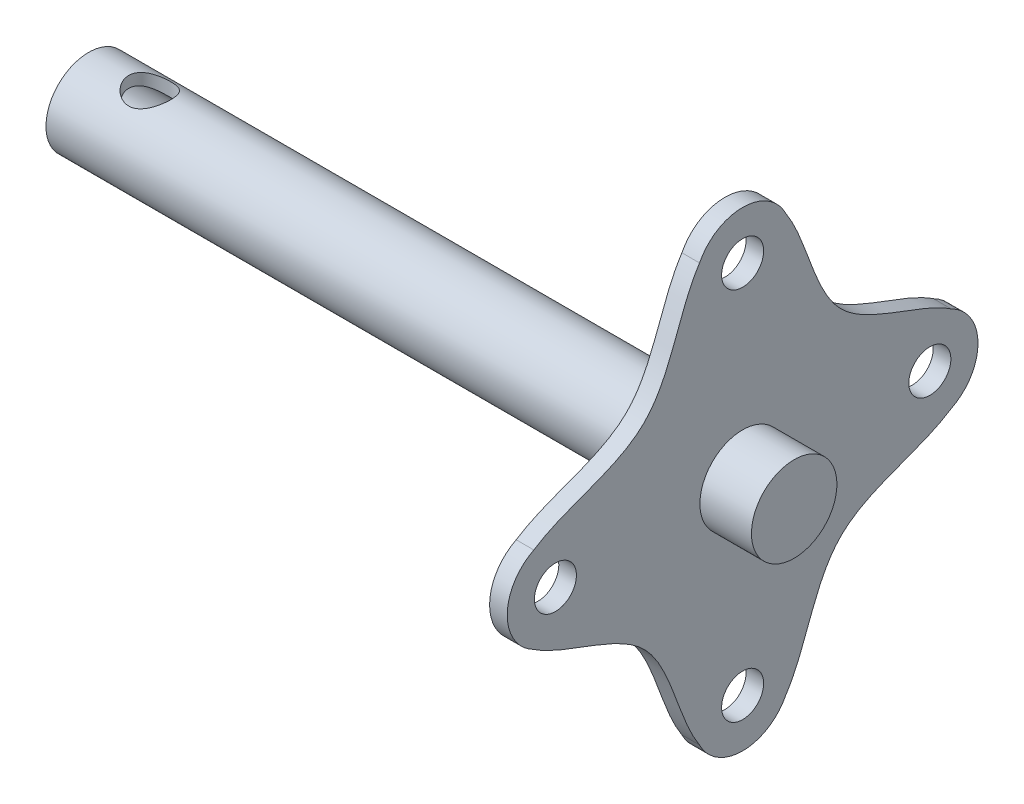
ISO-10303-21;
HEADER;
FILE_DESCRIPTION(('STEP AP214'),'2;1');
FILE_NAME('part.step','',(''),(''),'','','');
FILE_SCHEMA(('AUTOMOTIVE_DESIGN { 1 0 10303 214 1 1 1 1 }'));
ENDSEC;
DATA;
#1=APPLICATION_CONTEXT('core data for automotive mechanical design processes');
#2=APPLICATION_PROTOCOL_DEFINITION('international standard','automotive_design',2000,#1);
#3=PRODUCT_CONTEXT('',#1,'mechanical');
#4=PRODUCT('Part','Part','',(#3));
#5=PRODUCT_RELATED_PRODUCT_CATEGORY('part','',(#4));
#6=PRODUCT_DEFINITION_FORMATION('','',#4);
#7=PRODUCT_DEFINITION_CONTEXT('part definition',#1,'design');
#8=PRODUCT_DEFINITION('design','',#6,#7);
#9=PRODUCT_DEFINITION_SHAPE('','',#8);
#10=(LENGTH_UNIT() NAMED_UNIT(*) SI_UNIT(.MILLI.,.METRE.));
#11=(NAMED_UNIT(*) PLANE_ANGLE_UNIT() SI_UNIT($,.RADIAN.));
#12=(NAMED_UNIT(*) SI_UNIT($,.STERADIAN.) SOLID_ANGLE_UNIT());
#13=UNCERTAINTY_MEASURE_WITH_UNIT(LENGTH_MEASURE(1.E-05),#10,'distance_accuracy_value','');
#14=(GEOMETRIC_REPRESENTATION_CONTEXT(3) GLOBAL_UNCERTAINTY_ASSIGNED_CONTEXT((#13)) GLOBAL_UNIT_ASSIGNED_CONTEXT((#10,
#11,#12)) REPRESENTATION_CONTEXT('',''));
#15=CARTESIAN_POINT('',(0.,0.,0.));
#16=DIRECTION('',(0.,0.,1.));
#17=DIRECTION('',(1.,0.,0.));
#18=AXIS2_PLACEMENT_3D('',#15,#16,#17);
#19=CARTESIAN_POINT('',(43.688,44.069,0.));
#20=DIRECTION('',(-1.,0.,0.));
#21=DIRECTION('',(0.,-1.,0.));
#22=AXIS2_PLACEMENT_3D('',#19,#20,#21);
#23=PLANE('',#22);
#24=CARTESIAN_POINT('',(43.688,0.,0.));
#25=DIRECTION('',(-1.,0.,0.));
#26=DIRECTION('',(0.,-1.,0.));
#27=AXIS2_PLACEMENT_3D('',#24,#25,#26);
#28=CIRCLE('',#27,8.001);
#29=CARTESIAN_POINT('',(43.688,-8.001,0.));
#30=VERTEX_POINT('',#29);
#31=EDGE_CURVE('E576',#30,#30,#28,.T.);
#32=ORIENTED_EDGE('',*,*,#31,.T.);
#33=EDGE_LOOP('',(#32));
#34=FACE_BOUND('',#33,.T.);
#35=CARTESIAN_POINT('',(43.688,35.052,0.));
#36=DIRECTION('',(-1.,0.,0.));
#37=DIRECTION('',(0.,-1.,0.));
#38=AXIS2_PLACEMENT_3D('',#35,#36,#37);
#39=CIRCLE('',#38,9.01700000000001);
#40=CARTESIAN_POINT('',(43.688,39.0864264033594,-8.06409899467209));
#41=VERTEX_POINT('',#40);
#42=CARTESIAN_POINT('',(43.688,39.0864264033595,8.06409899467233));
#43=VERTEX_POINT('',#42);
#44=EDGE_CURVE('E350',#41,#43,#39,.F.);
#45=ORIENTED_EDGE('',*,*,#44,.T.);
#46=CARTESIAN_POINT('',(43.688,8.06409899467319,39.0864264033595));
#47=CARTESIAN_POINT('',(43.688,12.1825211951368,32.8636804844215));
#48=CARTESIAN_POINT('',(43.688,14.2958226438149,14.2947688313508));
#49=CARTESIAN_POINT('',(43.688,32.8644268661158,12.1822744919616));
#50=CARTESIAN_POINT('',(43.688,39.0864264033596,8.06409899467229));
#51=B_SPLINE_CURVE_WITH_KNOTS('',3,(#46,#47,#48,#49,#50),.UNSPECIFIED.,.F.,.F.,(4,1,4),(0.,
0.500028123499448,1.),.UNSPECIFIED.);
#52=CARTESIAN_POINT('',(43.688,8.06409899467319,39.0864264033595));
#53=VERTEX_POINT('',#52);
#54=EDGE_CURVE('E343',#43,#53,#51,.F.);
#55=ORIENTED_EDGE('',*,*,#54,.T.);
#56=CARTESIAN_POINT('',(43.688,1.09337573582874E-12,35.052));
#57=DIRECTION('',(-1.,0.,0.));
#58=DIRECTION('',(0.,-1.,0.));
#59=AXIS2_PLACEMENT_3D('',#56,#57,#58);
#60=CIRCLE('',#59,9.017);
#61=CARTESIAN_POINT('',(43.688,-8.06409899467119,39.0864264033596));
#62=VERTEX_POINT('',#61);
#63=EDGE_CURVE('E329',#62,#53,#60,.T.);
#64=ORIENTED_EDGE('',*,*,#63,.F.);
#65=CARTESIAN_POINT('',(43.688,-39.0864264033584,8.06409899467319));
#66=CARTESIAN_POINT('',(43.688,-32.86332328412,12.1824851024218));
#67=CARTESIAN_POINT('',(43.688,-14.2949603748562,14.2968765241275));
#68=CARTESIAN_POINT('',(43.688,-12.1820364728834,32.8646805234943));
#69=CARTESIAN_POINT('',(43.688,-8.0640989946712,39.0864264033596));
#70=B_SPLINE_CURVE_WITH_KNOTS('',3,(#65,#66,#67,#68,#69),.UNSPECIFIED.,.F.,.F.,(4,1,4),(0.,
0.500051140167016,1.),.UNSPECIFIED.);
#71=CARTESIAN_POINT('',(43.688,-39.0864264033584,8.06409899467319));
#72=VERTEX_POINT('',#71);
#73=EDGE_CURVE('E337',#62,#72,#70,.F.);
#74=ORIENTED_EDGE('',*,*,#73,.T.);
#75=CARTESIAN_POINT('',(43.688,-35.0519999999989,8.1581997967245E-13));
#76=DIRECTION('',(-1.,0.,0.));
#77=DIRECTION('',(0.,-1.,0.));
#78=AXIS2_PLACEMENT_3D('',#75,#76,#77);
#79=CIRCLE('',#78,9.017);
#80=CARTESIAN_POINT('',(43.688,-39.0864264033585,-8.06409899467119));
#81=VERTEX_POINT('',#80);
#82=EDGE_CURVE('E440',#72,#81,#79,.F.);
#83=ORIENTED_EDGE('',*,*,#82,.T.);
#84=CARTESIAN_POINT('',(43.688,-8.06409899467209,-39.0864264033583));
#85=CARTESIAN_POINT('',(43.688,-12.1824851024222,-32.8633232841207));
#86=CARTESIAN_POINT('',(43.688,-14.2968765241268,-14.2949603748562));
#87=CARTESIAN_POINT('',(43.688,-32.8646805234939,-12.1820364728841));
#88=CARTESIAN_POINT('',(43.688,-39.0864264033585,-8.06409899467119));
#89=B_SPLINE_CURVE_WITH_KNOTS('',3,(#84,#85,#86,#87,#88),.UNSPECIFIED.,.F.,.F.,(4,1,4),(0.,
0.500051140167029,1.),.UNSPECIFIED.);
#90=CARTESIAN_POINT('',(43.688,-8.06409899467209,-39.0864264033583));
#91=VERTEX_POINT('',#90);
#92=EDGE_CURVE('E410',#81,#91,#89,.F.);
#93=ORIENTED_EDGE('',*,*,#92,.T.);
#94=CARTESIAN_POINT('',(43.688,2.8184838811666E-13,-35.0519999999989));
#95=DIRECTION('',(-1.,0.,0.));
#96=DIRECTION('',(0.,-1.,0.));
#97=AXIS2_PLACEMENT_3D('',#94,#95,#96);
#98=CIRCLE('',#97,9.017);
#99=CARTESIAN_POINT('',(43.688,8.06409899467229,-39.0864264033585));
#100=VERTEX_POINT('',#99);
#101=EDGE_CURVE('E409',#91,#100,#98,.F.);
#102=ORIENTED_EDGE('',*,*,#101,.T.);
#103=CARTESIAN_POINT('',(43.688,39.0864264033594,-8.06409899467209));
#104=CARTESIAN_POINT('',(43.688,32.8633232841211,-12.1824851024215));
#105=CARTESIAN_POINT('',(43.688,14.294960374857,-14.2968765241268));
#106=CARTESIAN_POINT('',(43.688,12.1820364728836,-32.8646805234932));
#107=CARTESIAN_POINT('',(43.688,8.06409899467229,-39.0864264033585));
#108=B_SPLINE_CURVE_WITH_KNOTS('',3,(#103,#104,#105,#106,#107),.UNSPECIFIED.,.F.,.F.,(4,1,4),
(0.,0.500051140167044,1.),.UNSPECIFIED.);
#109=EDGE_CURVE('E399',#100,#41,#108,.F.);
#110=ORIENTED_EDGE('',*,*,#109,.T.);
#111=EDGE_LOOP('',(#45,#55,#64,#74,#83,#93,#102,#110));
#112=FACE_BOUND('',#111,.T.);
#113=CARTESIAN_POINT('',(43.688,-35.0519999999989,8.1581997967245E-13));
#114=DIRECTION('',(-1.,0.,0.));
#115=DIRECTION('',(0.,-1.,0.));
#116=AXIS2_PLACEMENT_3D('',#113,#114,#115);
#117=CIRCLE('',#116,3.9370000000011);
#118=CARTESIAN_POINT('',(43.688,-38.989,8.1581997967245E-13));
#119=VERTEX_POINT('',#118);
#120=EDGE_CURVE('E455',#119,#119,#117,.F.);
#121=ORIENTED_EDGE('',*,*,#120,.F.);
#122=EDGE_LOOP('',(#121));
#123=FACE_BOUND('',#122,.T.);
#124=CARTESIAN_POINT('',(43.688,2.8184838811666E-13,-35.0519999999989));
#125=DIRECTION('',(-1.,0.,0.));
#126=DIRECTION('',(0.,-1.,0.));
#127=AXIS2_PLACEMENT_3D('',#124,#125,#126);
#128=CIRCLE('',#127,3.93700000000018);
#129=CARTESIAN_POINT('',(43.688,-3.9369999999999,-35.0519999999989));
#130=VERTEX_POINT('',#129);
#131=EDGE_CURVE('E451',#130,#130,#128,.F.);
#132=ORIENTED_EDGE('',*,*,#131,.F.);
#133=EDGE_LOOP('',(#132));
#134=FACE_BOUND('',#133,.T.);
#135=CARTESIAN_POINT('',(43.688,35.052,0.));
#136=DIRECTION('',(-1.,0.,0.));
#137=DIRECTION('',(0.,-1.,0.));
#138=AXIS2_PLACEMENT_3D('',#135,#136,#137);
#139=CIRCLE('',#138,3.93700000000022);
#140=CARTESIAN_POINT('',(43.688,31.1149999999998,0.));
#141=VERTEX_POINT('',#140);
#142=EDGE_CURVE('E359',#141,#141,#139,.F.);
#143=ORIENTED_EDGE('',*,*,#142,.F.);
#144=EDGE_LOOP('',(#143));
#145=FACE_BOUND('',#144,.T.);
#146=CARTESIAN_POINT('',(43.688,1.09337573582874E-12,35.052));
#147=DIRECTION('',(-1.,0.,0.));
#148=DIRECTION('',(0.,-1.,0.));
#149=AXIS2_PLACEMENT_3D('',#146,#147,#148);
#150=CIRCLE('',#149,3.9369999999993);
#151=CARTESIAN_POINT('',(43.688,-3.93699999999821,35.052));
#152=VERTEX_POINT('',#151);
#153=EDGE_CURVE('E533',#152,#152,#150,.T.);
#154=ORIENTED_EDGE('',*,*,#153,.T.);
#155=EDGE_LOOP('',(#154));
#156=FACE_BOUND('',#155,.T.);
#157=ADVANCED_FACE('F262',(#34,#112,#123,#134,#145,#156),#23,.F.);
#158=CARTESIAN_POINT('',(40.386,8.001,0.));
#159=DIRECTION('',(1.,0.,0.));
#160=DIRECTION('',(0.,1.,0.));
#161=AXIS2_PLACEMENT_3D('',#158,#159,#160);
#162=PLANE('',#161);
#163=CARTESIAN_POINT('',(40.386,8.06409899467319,39.0864264033595));
#164=CARTESIAN_POINT('',(40.386,12.1825211951368,32.8636804844215));
#165=CARTESIAN_POINT('',(40.386,14.2958226438149,14.2947688313508));
#166=CARTESIAN_POINT('',(40.386,32.8644268661158,12.1822744919616));
#167=CARTESIAN_POINT('',(40.386,39.0864264033596,8.06409899467229));
#168=B_SPLINE_CURVE_WITH_KNOTS('',3,(#163,#164,#165,#166,#167),.UNSPECIFIED.,.F.,.F.,(4,1,4),
(0.,0.500028123499448,1.),.UNSPECIFIED.);
#169=CARTESIAN_POINT('',(40.386,39.0864264033595,8.06409899467233));
#170=VERTEX_POINT('',#169);
#171=CARTESIAN_POINT('',(40.386,8.0640989946732,39.0864264033595));
#172=VERTEX_POINT('',#171);
#173=EDGE_CURVE('E12',#170,#172,#168,.F.);
#174=ORIENTED_EDGE('',*,*,#173,.F.);
#175=CARTESIAN_POINT('',(40.386,35.052,0.));
#176=DIRECTION('',(1.,0.,0.));
#177=DIRECTION('',(0.,1.,0.));
#178=AXIS2_PLACEMENT_3D('',#175,#176,#177);
#179=CIRCLE('',#178,9.01700000000001);
#180=CARTESIAN_POINT('',(40.386,39.0864264033596,-8.06409899467228));
#181=VERTEX_POINT('',#180);
#182=EDGE_CURVE('E511',#181,#170,#179,.T.);
#183=ORIENTED_EDGE('',*,*,#182,.F.);
#184=CARTESIAN_POINT('',(40.386,39.0864264033594,-8.06409899467209));
#185=CARTESIAN_POINT('',(40.386,32.8633232841211,-12.1824851024215));
#186=CARTESIAN_POINT('',(40.386,14.294960374857,-14.2968765241268));
#187=CARTESIAN_POINT('',(40.386,12.1820364728836,-32.8646805234932));
#188=CARTESIAN_POINT('',(40.386,8.06409899467229,-39.0864264033585));
#189=B_SPLINE_CURVE_WITH_KNOTS('',3,(#184,#185,#186,#187,#188),.UNSPECIFIED.,.F.,.F.,(4,1,4),
(0.,0.500051140167044,1.),.UNSPECIFIED.);
#190=CARTESIAN_POINT('',(40.386,8.06409899467229,-39.0864264033585));
#191=VERTEX_POINT('',#190);
#192=EDGE_CURVE('E272',#191,#181,#189,.F.);
#193=ORIENTED_EDGE('',*,*,#192,.F.);
#194=CARTESIAN_POINT('',(40.386,2.8184838811666E-13,-35.0519999999989));
#195=DIRECTION('',(1.,0.,0.));
#196=DIRECTION('',(0.,1.,0.));
#197=AXIS2_PLACEMENT_3D('',#194,#195,#196);
#198=CIRCLE('',#197,9.017);
#199=CARTESIAN_POINT('',(40.386,-8.0640989946721,-39.0864264033584));
#200=VERTEX_POINT('',#199);
#201=EDGE_CURVE('E505',#200,#191,#198,.T.);
#202=ORIENTED_EDGE('',*,*,#201,.F.);
#203=CARTESIAN_POINT('',(40.386,-8.06409899467209,-39.0864264033583));
#204=CARTESIAN_POINT('',(40.386,-12.1824851024222,-32.8633232841207));
#205=CARTESIAN_POINT('',(40.386,-14.2968765241268,-14.2949603748562));
#206=CARTESIAN_POINT('',(40.386,-32.8646805234939,-12.1820364728841));
#207=CARTESIAN_POINT('',(40.386,-39.0864264033585,-8.06409899467119));
#208=B_SPLINE_CURVE_WITH_KNOTS('',3,(#203,#204,#205,#206,#207),.UNSPECIFIED.,.F.,.F.,(4,1,4),
(0.,0.500051140167029,1.),.UNSPECIFIED.);
#209=CARTESIAN_POINT('',(40.386,-39.0864264033585,-8.06409899467119));
#210=VERTEX_POINT('',#209);
#211=EDGE_CURVE('E507',#210,#200,#208,.F.);
#212=ORIENTED_EDGE('',*,*,#211,.F.);
#213=CARTESIAN_POINT('',(40.386,-35.0519999999989,8.1581997967245E-13));
#214=DIRECTION('',(1.,0.,0.));
#215=DIRECTION('',(0.,1.,0.));
#216=AXIS2_PLACEMENT_3D('',#213,#214,#215);
#217=CIRCLE('',#216,9.017);
#218=CARTESIAN_POINT('',(40.386,-39.0864264033584,8.06409899467319));
#219=VERTEX_POINT('',#218);
#220=EDGE_CURVE('E489',#219,#210,#217,.T.);
#221=ORIENTED_EDGE('',*,*,#220,.F.);
#222=CARTESIAN_POINT('',(40.386,-39.0864264033584,8.06409899467319));
#223=CARTESIAN_POINT('',(40.386,-32.86332328412,12.1824851024218));
#224=CARTESIAN_POINT('',(40.386,-14.2949603748562,14.2968765241275));
#225=CARTESIAN_POINT('',(40.386,-12.1820364728834,32.8646805234943));
#226=CARTESIAN_POINT('',(40.386,-8.0640989946712,39.0864264033596));
#227=B_SPLINE_CURVE_WITH_KNOTS('',3,(#222,#223,#224,#225,#226),.UNSPECIFIED.,.F.,.F.,(4,1,4),
(0.,0.500051140167016,1.),.UNSPECIFIED.);
#228=CARTESIAN_POINT('',(40.386,-8.06409899467119,39.0864264033596));
#229=VERTEX_POINT('',#228);
#230=EDGE_CURVE('E497',#229,#219,#227,.F.);
#231=ORIENTED_EDGE('',*,*,#230,.F.);
#232=CARTESIAN_POINT('',(40.386,1.09337573582874E-12,35.052));
#233=DIRECTION('',(1.,0.,0.));
#234=DIRECTION('',(0.,1.,0.));
#235=AXIS2_PLACEMENT_3D('',#232,#233,#234);
#236=CIRCLE('',#235,9.017);
#237=EDGE_CURVE('E288',#229,#172,#236,.F.);
#238=ORIENTED_EDGE('',*,*,#237,.T.);
#239=EDGE_LOOP('',(#174,#183,#193,#202,#212,#221,#231,#238));
#240=FACE_BOUND('',#239,.T.);
#241=CARTESIAN_POINT('',(40.386,0.,0.));
#242=DIRECTION('',(-1.,0.,0.));
#243=DIRECTION('',(0.,-1.,0.));
#244=AXIS2_PLACEMENT_3D('',#241,#242,#243);
#245=CIRCLE('',#244,8.001);
#246=CARTESIAN_POINT('',(40.386,-8.001,0.));
#247=VERTEX_POINT('',#246);
#248=EDGE_CURVE('E466',#247,#247,#245,.T.);
#249=ORIENTED_EDGE('',*,*,#248,.F.);
#250=EDGE_LOOP('',(#249));
#251=FACE_BOUND('',#250,.T.);
#252=CARTESIAN_POINT('',(40.386,-35.0519999999989,8.1581997967245E-13));
#253=DIRECTION('',(1.,0.,0.));
#254=DIRECTION('',(0.,1.,0.));
#255=AXIS2_PLACEMENT_3D('',#252,#253,#254);
#256=CIRCLE('',#255,3.9370000000011);
#257=CARTESIAN_POINT('',(40.386,-31.1149999999978,8.1581997967245E-13));
#258=VERTEX_POINT('',#257);
#259=EDGE_CURVE('E458',#258,#258,#256,.T.);
#260=ORIENTED_EDGE('',*,*,#259,.T.);
#261=EDGE_LOOP('',(#260));
#262=FACE_BOUND('',#261,.T.);
#263=CARTESIAN_POINT('',(40.386,2.8184838811666E-13,-35.0519999999989));
#264=DIRECTION('',(1.,0.,0.));
#265=DIRECTION('',(0.,1.,0.));
#266=AXIS2_PLACEMENT_3D('',#263,#264,#265);
#267=CIRCLE('',#266,3.93700000000018);
#268=CARTESIAN_POINT('',(40.386,3.93700000000046,-35.0519999999989));
#269=VERTEX_POINT('',#268);
#270=EDGE_CURVE('E454',#269,#269,#267,.T.);
#271=ORIENTED_EDGE('',*,*,#270,.T.);
#272=EDGE_LOOP('',(#271));
#273=FACE_BOUND('',#272,.T.);
#274=CARTESIAN_POINT('',(40.386,35.052,0.));
#275=DIRECTION('',(1.,0.,0.));
#276=DIRECTION('',(0.,1.,0.));
#277=AXIS2_PLACEMENT_3D('',#274,#275,#276);
#278=CIRCLE('',#277,3.93700000000022);
#279=CARTESIAN_POINT('',(40.386,38.9890000000002,0.));
#280=VERTEX_POINT('',#279);
#281=EDGE_CURVE('E353',#280,#280,#278,.T.);
#282=ORIENTED_EDGE('',*,*,#281,.T.);
#283=EDGE_LOOP('',(#282));
#284=FACE_BOUND('',#283,.T.);
#285=CARTESIAN_POINT('',(40.386,1.09337573582874E-12,35.052));
#286=DIRECTION('',(1.,0.,0.));
#287=DIRECTION('',(0.,1.,0.));
#288=AXIS2_PLACEMENT_3D('',#285,#286,#287);
#289=CIRCLE('',#288,3.9369999999993);
#290=CARTESIAN_POINT('',(40.386,3.9370000000004,35.052));
#291=VERTEX_POINT('',#290);
#292=EDGE_CURVE('E267',#291,#291,#289,.F.);
#293=ORIENTED_EDGE('',*,*,#292,.F.);
#294=EDGE_LOOP('',(#293));
#295=FACE_BOUND('',#294,.T.);
#296=ADVANCED_FACE('F479',(#240,#251,#262,#273,#284,#295),#162,.F.);
#297=CARTESIAN_POINT('',(-53.34,0.,0.));
#298=DIRECTION('',(-1.,0.,0.));
#299=DIRECTION('',(0.,-1.,0.));
#300=AXIS2_PLACEMENT_3D('',#297,#298,#299);
#301=CYLINDRICAL_SURFACE('',#300,8.001);
#302=CARTESIAN_POINT('',(-67.31,6.96534507400746,3.937));
#303=CARTESIAN_POINT('',(-67.4128745950958,6.9653458303171,3.93699939109406));
#304=CARTESIAN_POINT('',(-67.5157613248099,6.96763214874904,3.93296213981109));
#305=CARTESIAN_POINT('',(-67.7207454803312,6.97669317154756,3.91686558861347));
#306=CARTESIAN_POINT('',(-67.8228424986573,6.98347005460043,3.9048023947424));
#307=CARTESIAN_POINT('',(-68.0255890651015,7.00127778350322,3.87278282861104));
#308=CARTESIAN_POINT('',(-68.1262359771466,7.01231555822405,3.85281359854815));
#309=CARTESIAN_POINT('',(-68.3252140016487,7.03824802506605,3.80523230037071));
#310=CARTESIAN_POINT('',(-68.4235440915821,7.05314438662359,3.77761692375639));
#311=CARTESIAN_POINT('',(-68.7129922842562,7.10271329437791,3.6840828441296));
#312=CARTESIAN_POINT('',(-68.8998564748345,7.14238903037297,3.60726809257177));
#313=CARTESIAN_POINT('',(-69.2579013857005,7.23049720279591,3.42722871425422));
#314=CARTESIAN_POINT('',(-69.4290816884626,7.27892987224291,3.32400338468742));
#315=CARTESIAN_POINT('',(-69.7660983283385,7.38382054941182,3.08441718271683));
#316=CARTESIAN_POINT('',(-69.9304200061645,7.4406105408515,2.94607039257622));
#317=CARTESIAN_POINT('',(-70.2347542543281,7.55315768309138,2.64418169360324));
#318=CARTESIAN_POINT('',(-70.3747550200687,7.60891432067127,2.48062762223439));
#319=CARTESIAN_POINT('',(-70.5680056387821,7.68940339963424,2.21326577631231));
#320=CARTESIAN_POINT('',(-70.6312366207172,7.71646474779913,2.11722354303));
#321=CARTESIAN_POINT('',(-70.7493062116086,7.76801352536852,1.9194751855407));
#322=CARTESIAN_POINT('',(-70.8041483719917,7.79250204260421,1.81777148314046));
#323=CARTESIAN_POINT('',(-70.9049156011855,7.83820350831586,1.60933341586212));
#324=CARTESIAN_POINT('',(-70.9508407094417,7.85941647128151,1.50259907324023));
#325=CARTESIAN_POINT('',(-71.033237314902,7.89792382301572,1.28491430981459));
#326=CARTESIAN_POINT('',(-71.0697140675198,7.91522038950599,1.17396627232507));
#327=CARTESIAN_POINT('',(-71.1306035443868,7.94433002365216,0.956462204693508));
#328=CARTESIAN_POINT('',(-71.1556739104861,7.95643861470096,0.850129629410474));
#329=CARTESIAN_POINT('',(-71.1969222980051,7.9764572967297,0.635411309529433));
#330=CARTESIAN_POINT('',(-71.2131046291536,7.98436942247418,0.527026586420898));
#331=CARTESIAN_POINT('',(-71.2363779438817,7.99577217161585,0.30908264143395));
#332=CARTESIAN_POINT('',(-71.2434713869572,7.99926399116558,0.199523745387619));
#333=CARTESIAN_POINT('',(-71.2484783930669,8.00172726997892,-0.0198499832965085));
#334=CARTESIAN_POINT('',(-71.2463924947167,8.00069899446772,-0.129664800539739));
#335=CARTESIAN_POINT('',(-71.2336328937154,7.99442922939904,-0.33933774676054));
#336=CARTESIAN_POINT('',(-71.2237005128483,7.98955147075929,-0.439252380088351));
#337=CARTESIAN_POINT('',(-71.1962883991126,7.97616038408474,-0.637803321326534));
#338=CARTESIAN_POINT('',(-71.1788062289685,7.96764588202091,-0.736439205821742));
#339=CARTESIAN_POINT('',(-71.115292433819,7.93692936274259,-1.02933419863571));
#340=CARTESIAN_POINT('',(-71.0581810696312,7.90954784270354,-1.22077867598568));
#341=CARTESIAN_POINT('',(-70.9156559742738,7.84300900830077,-1.59364257729763));
#342=CARTESIAN_POINT('',(-70.8298529527929,7.80369044710555,-1.77488167242374));
#343=CARTESIAN_POINT('',(-70.6328840124716,7.71685004533034,-2.12086303649826));
#344=CARTESIAN_POINT('',(-70.5217089280418,7.66932524178118,-2.28559931282621));
#345=CARTESIAN_POINT('',(-70.265339034986,7.56538852827251,-2.61008526149251));
#346=CARTESIAN_POINT('',(-70.1179513109203,7.50856121574129,-2.76797116157195));
#347=CARTESIAN_POINT('',(-69.7992828617512,7.39529123490447,-3.05776366226356));
#348=CARTESIAN_POINT('',(-69.6279849097415,7.33884887497983,-3.18965136487112));
#349=CARTESIAN_POINT('',(-69.2535277704718,7.22907929801775,-3.43149188122206));
#350=CARTESIAN_POINT('',(-69.0490731544142,7.1761425560865,-3.53965237764081));
#351=CARTESIAN_POINT('',(-68.7287859073049,7.10760503382628,-3.67430004853825));
#352=CARTESIAN_POINT('',(-68.6197313119881,7.08656714263441,-3.71458938822289));
#353=CARTESIAN_POINT('',(-68.3978089455742,7.04893169026019,-3.78552239403873));
#354=CARTESIAN_POINT('',(-68.2849435359181,7.03233143409486,-3.81617191645264));
#355=CARTESIAN_POINT('',(-68.0652359765834,7.00538819107579,-3.86539282870238));
#356=CARTESIAN_POINT('',(-67.9586095903597,6.99465848047329,-3.88471915024925));
#357=CARTESIAN_POINT('',(-67.743801197628,6.9780198995748,-3.9145284348531));
#358=CARTESIAN_POINT('',(-67.635620016679,6.97210856055717,-3.92501592663131));
#359=CARTESIAN_POINT('',(-67.4186386213625,6.96534847304411,-3.9370000639504));
#360=CARTESIAN_POINT('',(-67.309838625717,6.96449803506002,-3.93849970991936));
#361=CARTESIAN_POINT('',(-67.0925730127219,6.96789130423071,-3.93249332177485));
#362=CARTESIAN_POINT('',(-66.9841073748794,6.97213469270047,-3.92498785104841));
#363=CARTESIAN_POINT('',(-66.7797647818454,6.98483334024104,-3.90233928129893));
#364=CARTESIAN_POINT('',(-66.6837584833042,6.99280126049184,-3.88807782791903));
#365=CARTESIAN_POINT('',(-66.4934091939678,7.01240823818075,-3.85260114081025));
#366=CARTESIAN_POINT('',(-66.3990667658441,7.02404851328491,-3.83138360051585));
#367=CARTESIAN_POINT('',(-66.1194572789069,7.06395869848555,-3.75761422973843));
#368=CARTESIAN_POINT('',(-65.9374701200216,7.09722733962405,-3.69493001189329));
#369=CARTESIAN_POINT('',(-65.5782056908328,7.17515440815313,-3.54130749066464));
#370=CARTESIAN_POINT('',(-65.4015392989423,7.22026989867108,-3.44919260544447));
#371=CARTESIAN_POINT('',(-65.0651317899764,7.31638270866578,-3.24033166478018));
#372=CARTESIAN_POINT('',(-64.9053993841167,7.36738302752662,-3.12357302352505));
#373=CARTESIAN_POINT('',(-64.5871836809485,7.47695033231689,-2.85221554568781));
#374=CARTESIAN_POINT('',(-64.4312021735031,7.53568474968997,-2.69474463913301));
#375=CARTESIAN_POINT('',(-64.1470699077555,7.64873503682045,-2.35475035603612));
#376=CARTESIAN_POINT('',(-64.0189276251088,7.70304955780089,-2.17221937747697));
#377=CARTESIAN_POINT('',(-63.8492674235564,7.77753589690337,-1.8805312127528));
#378=CARTESIAN_POINT('',(-63.7959818721509,7.80144020347088,-1.77900557278855));
#379=CARTESIAN_POINT('',(-63.6982476169883,7.84594722638788,-1.57110944669225));
#380=CARTESIAN_POINT('',(-63.6537949510707,7.86655142225735,-1.4647411592608));
#381=CARTESIAN_POINT('',(-63.5742396609538,7.90384110044954,-1.24795560021831));
#382=CARTESIAN_POINT('',(-63.5391327917765,7.92052836148436,-1.13754019287668));
#383=CARTESIAN_POINT('',(-63.4786895248115,7.94948214672487,-0.913501120983262));
#384=CARTESIAN_POINT('',(-63.4533520132638,7.96174917485081,-0.799877823734502));
#385=CARTESIAN_POINT('',(-63.4146294374267,7.98058179310605,-0.580772056425314));
#386=CARTESIAN_POINT('',(-63.400373210366,7.98756146937857,-0.475478388457008));
#387=CARTESIAN_POINT('',(-63.3804133825924,7.99735000491514,-0.263851821994805));
#388=CARTESIAN_POINT('',(-63.3747126314522,8.00015747453908,-0.157518589116746));
#389=CARTESIAN_POINT('',(-63.3719519036324,8.00151554256684,0.0552216210849142));
#390=CARTESIAN_POINT('',(-63.3748861075012,8.00006900791964,0.161628500446405));
#391=CARTESIAN_POINT('',(-63.3893345772335,7.9929731247465,0.373728730761459));
#392=CARTESIAN_POINT('',(-63.4008519951801,7.98732223222138,0.479421805186398));
#393=CARTESIAN_POINT('',(-63.4461251343012,7.96522635517352,0.780928324095028));
#394=CARTESIAN_POINT('',(-63.490516539815,7.94366509722196,0.974891486795582));
#395=CARTESIAN_POINT('',(-63.6072175941544,7.8882208223521,1.35220805342243));
#396=CARTESIAN_POINT('',(-63.679531369809,7.85433598409456,1.53555988442258));
#397=CARTESIAN_POINT('',(-63.8533407379191,7.77549122096505,1.89555741388328));
#398=CARTESIAN_POINT('',(-63.9559712164415,7.73011282736002,2.07156215621292));
#399=CARTESIAN_POINT('',(-64.1860700149027,7.63309249675511,2.40458867145141));
#400=CARTESIAN_POINT('',(-64.3135497726364,7.58144767955174,2.56160164856341));
#401=CARTESIAN_POINT('',(-64.6040088910133,7.47118684383854,2.86817020511727));
#402=CARTESIAN_POINT('',(-64.7692291435064,7.41237967118773,3.01553599159749));
#403=CARTESIAN_POINT('',(-65.1231672914727,7.29864896859967,3.28126005404308));
#404=CARTESIAN_POINT('',(-65.3119046738135,7.24372871933916,3.39959402925554));
#405=CARTESIAN_POINT('',(-65.6121349596504,7.1686130079402,3.55392577241262));
#406=CARTESIAN_POINT('',(-65.7166016665821,7.14451113442315,3.60199261803217));
#407=CARTESIAN_POINT('',(-65.9299958029729,7.0999702738811,3.68901234780726));
#408=CARTESIAN_POINT('',(-66.0389209050152,7.07952940492087,3.72796991774082));
#409=CARTESIAN_POINT('',(-66.2601759847357,7.04317285684812,3.79621009198302));
#410=CARTESIAN_POINT('',(-66.3724963250727,7.02724549666498,3.82551770308445));
#411=CARTESIAN_POINT('',(-66.5998202716575,7.0005479357119,3.87415861629942));
#412=CARTESIAN_POINT('',(-66.7148219205911,6.98977408938126,3.89349896993508));
#413=CARTESIAN_POINT('',(-66.9100048925491,6.97637032669398,3.91744505995291));
#414=CARTESIAN_POINT('',(-66.9897619849012,6.97224477429953,3.92477190036305));
#415=CARTESIAN_POINT('',(-67.1496769117247,6.96673176540048,3.9345497641192));
#416=CARTESIAN_POINT('',(-67.2298347715884,6.96534448465171,3.93700047449113));
#417=CARTESIAN_POINT('',(-67.31,6.96534507400746,3.937));
#418=B_SPLINE_CURVE_WITH_KNOTS('',3,(#302,#303,#304,#305,#306,#307,#308,#309,#310,#311,#312,
#313,#314,#315,#316,#317,#318,#319,#320,#321,#322,#323,#324,#325,#326,#327,#328,#329,#330,#331,
#332,#333,#334,#335,#336,#337,#338,#339,#340,#341,#342,#343,#344,#345,#346,#347,#348,#349,#350,
#351,#352,#353,#354,#355,#356,#357,#358,#359,#360,#361,#362,#363,#364,#365,#366,#367,#368,#369,
#370,#371,#372,#373,#374,#375,#376,#377,#378,#379,#380,#381,#382,#383,#384,#385,#386,#387,#388,
#389,#390,#391,#392,#393,#394,#395,#396,#397,#398,#399,#400,#401,#402,#403,#404,#405,#406,#407,
#408,#409,#410,#411,#412,#413,#414,#415,#416,#417),.UNSPECIFIED.,.T.,.F.,(4,2,2,2,2,2,2,2,2,2,2,
2,2,2,2,2,2,2,2,2,2,2,2,2,2,2,2,2,2,2,2,2,2,2,2,2,2,2,2,2,2,2,2,2,2,2,2,2,2,2,2,2,2,2,2,2,2,4),
(0.,0.308540624604432,0.617231053509922,0.926425590042646,1.23575412519034,1.85052895001307,
2.46532013619834,3.12913641114158,3.79327398660734,4.1472756089917,4.50112694670598,
4.8549767190829,5.20862924658205,5.53793555647889,5.86708204740004,6.19613945091173,
6.52517754661129,6.8263840086271,7.12768778097921,7.72970721768849,8.34025079713508,
8.95101528390479,9.61815458546957,10.2857770545226,10.9934821201063,11.3474851660256,
11.701272734383,12.0274983592892,12.3535567352874,12.6795062565892,13.0054353865771,
13.2972499892814,13.5891614526829,14.1725720562963,14.7830671850025,15.3938748573379,
16.0787738040954,16.7638809771206,17.1148566950356,17.465674618865,17.8163329238647,
18.1669512400733,18.4859818151574,18.8051186262065,19.1240404070918,19.4430793659589,
20.040550129994,20.6381092319491,21.2617225494083,21.8856235885381,22.569863305748,
23.2546738189415,23.6067438214922,23.9586323201424,24.3096016276194,24.6603222932781,
24.9007377448373,25.1411686269481),.UNSPECIFIED.);
#419=CARTESIAN_POINT('',(-67.31,6.96534507400746,3.937));
#420=VERTEX_POINT('',#419);
#421=EDGE_CURVE('E483',#420,#420,#418,.T.);
#422=ORIENTED_EDGE('',*,*,#421,.T.);
#423=EDGE_LOOP('',(#422));
#424=FACE_BOUND('',#423,.T.);
#425=CARTESIAN_POINT('',(-78.74,0.,0.));
#426=DIRECTION('',(-1.,0.,0.));
#427=DIRECTION('',(0.,-1.,0.));
#428=AXIS2_PLACEMENT_3D('',#425,#426,#427);
#429=CIRCLE('',#428,8.001);
#430=CARTESIAN_POINT('',(-78.74,-8.001,0.));
#431=VERTEX_POINT('',#430);
#432=EDGE_CURVE('E490',#431,#431,#429,.T.);
#433=ORIENTED_EDGE('',*,*,#432,.F.);
#434=EDGE_LOOP('',(#433));
#435=FACE_BOUND('',#434,.T.);
#436=ORIENTED_EDGE('',*,*,#248,.T.);
#437=EDGE_LOOP('',(#436));
#438=FACE_BOUND('',#437,.T.);
#439=ADVANCED_FACE('F264',(#424,#435,#438),#301,.T.);
#440=CARTESIAN_POINT('',(-78.74,8.001,0.));
#441=DIRECTION('',(1.,0.,0.));
#442=DIRECTION('',(0.,1.,0.));
#443=AXIS2_PLACEMENT_3D('',#440,#441,#442);
#444=PLANE('',#443);
#445=CARTESIAN_POINT('',(-78.74,0.,0.));
#446=DIRECTION('',(-1.,0.,0.));
#447=DIRECTION('',(0.,-1.,0.));
#448=AXIS2_PLACEMENT_3D('',#445,#446,#447);
#449=CIRCLE('',#448,5.90182644626);
#450=CARTESIAN_POINT('',(-78.74,-5.90182644626,0.));
#451=VERTEX_POINT('',#450);
#452=EDGE_CURVE('E571',#451,#451,#449,.T.);
#453=ORIENTED_EDGE('',*,*,#452,.F.);
#454=EDGE_LOOP('',(#453));
#455=FACE_BOUND('',#454,.T.);
#456=ORIENTED_EDGE('',*,*,#432,.T.);
#457=EDGE_LOOP('',(#456));
#458=FACE_BOUND('',#457,.T.);
#459=ADVANCED_FACE('F565',(#455,#458),#444,.F.);
#460=CARTESIAN_POINT('',(-53.34,0.,0.));
#461=DIRECTION('',(-1.,0.,0.));
#462=DIRECTION('',(0.,-1.,0.));
#463=AXIS2_PLACEMENT_3D('',#460,#461,#462);
#464=CYLINDRICAL_SURFACE('',#463,5.90182644626);
#465=CARTESIAN_POINT('',(-67.31,4.39676999646035,3.937));
#466=CARTESIAN_POINT('',(-67.2139137309751,4.39677053680936,3.93699973740308));
#467=CARTESIAN_POINT('',(-67.1178196942551,4.39993400179526,3.93347512856792));
#468=CARTESIAN_POINT('',(-66.9265431363658,4.41242684927236,3.9194553977141));
#469=CARTESIAN_POINT('',(-66.8313607607157,4.42175720001385,3.9089591810961));
#470=CARTESIAN_POINT('',(-66.6426156666474,4.44614647667638,3.88119524503223));
#471=CARTESIAN_POINT('',(-66.5490551597204,4.46121266592464,3.86391893905896));
#472=CARTESIAN_POINT('',(-66.3643156936105,4.49640580339735,3.82290699685214));
#473=CARTESIAN_POINT('',(-66.2731379797241,4.51653534166842,3.79916805428369));
#474=CARTESIAN_POINT('',(-66.0058119226379,4.58289653107054,3.71932424720528));
#475=CARTESIAN_POINT('',(-65.8338112085842,4.63539693995278,3.65427728914144));
#476=CARTESIAN_POINT('',(-65.5035510807174,4.75087260116159,3.50282866915616));
#477=CARTESIAN_POINT('',(-65.3452945168938,4.81385001814654,3.41642259242331));
#478=CARTESIAN_POINT('',(-65.0198580722219,4.95495862459523,3.2090530173606));
#479=CARTESIAN_POINT('',(-64.8551328974822,5.03392169340765,3.08480220289227));
#480=CARTESIAN_POINT('',(-64.54667232968,5.19133636248409,2.81183406579918));
#481=CARTESIAN_POINT('',(-64.4029576689456,5.26978738554337,2.66309288062157));
#482=CARTESIAN_POINT('',(-64.1956081862283,5.38768960731021,2.41135752021519));
#483=CARTESIAN_POINT('',(-64.1239797388365,5.42949172800004,2.31594370579057));
#484=CARTESIAN_POINT('',(-63.9891235740664,5.50970614524467,2.11803549037356));
#485=CARTESIAN_POINT('',(-63.9258922746626,5.5481198848397,2.01554413703652));
#486=CARTESIAN_POINT('',(-63.808562590921,5.62045555681158,1.80402968907782));
#487=CARTESIAN_POINT('',(-63.7544590417142,5.65438002704858,1.69501033591756));
#488=CARTESIAN_POINT('',(-63.6561278473509,5.71672295427462,1.47109746389952));
#489=CARTESIAN_POINT('',(-63.6118980833635,5.74514259238058,1.35620521183235));
#490=CARTESIAN_POINT('',(-63.5384564263079,5.79270546636075,1.13467092641465));
#491=CARTESIAN_POINT('',(-63.5081164687468,5.81253166504491,1.02854909970044));
#492=CARTESIAN_POINT('',(-63.4563272477907,5.84653723504457,0.813279880725489));
#493=CARTESIAN_POINT('',(-63.4348762403786,5.86071771403218,0.704133086452873));
#494=CARTESIAN_POINT('',(-63.401267121266,5.88299421181021,0.483912307770776));
#495=CARTESIAN_POINT('',(-63.3890998597843,5.89109622122545,0.372840331498774));
#496=CARTESIAN_POINT('',(-63.374263825896,5.90098077067354,0.149789390133396));
#497=CARTESIAN_POINT('',(-63.3715937105891,5.90276420415547,0.0378105555146677));
#498=CARTESIAN_POINT('',(-63.3754774152244,5.90017414837792,-0.16879248601065));
#499=CARTESIAN_POINT('',(-63.3806856285862,5.89669881690544,-0.263456959909899));
#500=CARTESIAN_POINT('',(-63.3978791291791,5.88525570113221,-0.451923597658334));
#501=CARTESIAN_POINT('',(-63.4098663992494,5.87728660242965,-0.545725501048486));
#502=CARTESIAN_POINT('',(-63.4404514447419,5.8570351254622,-0.731738861742577));
#503=CARTESIAN_POINT('',(-63.4590469716338,5.84475421435476,-0.823950848856122));
#504=CARTESIAN_POINT('',(-63.502604023917,5.81614862737629,-1.0062312559861));
#505=CARTESIAN_POINT('',(-63.5275680180799,5.79982238338017,-1.0962988298712));
#506=CARTESIAN_POINT('',(-63.6113417909691,5.74541821325178,-1.36166613157337));
#507=CARTESIAN_POINT('',(-63.6791936272502,5.7018061560594,-1.53308206330461));
#508=CARTESIAN_POINT('',(-63.8363455022906,5.60304722082572,-1.86198962581635));
#509=CARTESIAN_POINT('',(-63.9256494481549,5.54789824178398,-2.01947871292266));
#510=CARTESIAN_POINT('',(-64.1362162904327,5.42184909242131,-2.33842281533523));
#511=CARTESIAN_POINT('',(-64.2601372471768,5.34983133097698,-2.49767722693878));
#512=CARTESIAN_POINT('',(-64.5295824261777,5.20092760838349,-2.79455363753571));
#513=CARTESIAN_POINT('',(-64.6751399795151,5.12403424308446,-2.93214157378444));
#514=CARTESIAN_POINT('',(-64.9201274577013,5.00369879137412,-3.13078448555657));
#515=CARTESIAN_POINT('',(-65.0131171948571,4.95982742197311,-3.19964211738307));
#516=CARTESIAN_POINT('',(-65.2053324392061,4.87378794703499,-3.32923453840348));
#517=CARTESIAN_POINT('',(-65.3045593441447,4.83162022678758,-3.38996749725579));
#518=CARTESIAN_POINT('',(-65.6109850291102,4.70990091561342,-3.55915618834959));
#519=CARTESIAN_POINT('',(-65.827411318145,4.63488251394568,-3.65499558577703));
#520=CARTESIAN_POINT('',(-66.2157480208047,4.52822490755068,-3.78573085113692));
#521=CARTESIAN_POINT('',(-66.3827397992046,4.49031580254909,-3.83021317442204));
#522=CARTESIAN_POINT('',(-66.7240363353331,4.43247476662685,-3.89701336075081));
#523=CARTESIAN_POINT('',(-66.8983278338613,4.41251160457329,-3.91936973621833));
#524=CARTESIAN_POINT('',(-67.2502892838412,4.39365369758006,-3.94050778238821));
#525=CARTESIAN_POINT('',(-67.4279706462643,4.3948511233416,-3.93918631746258));
#526=CARTESIAN_POINT('',(-67.7802076552703,4.41833781095162,-3.91281485126497));
#527=CARTESIAN_POINT('',(-67.9547606546452,4.44064414899732,-3.88774563907559));
#528=CARTESIAN_POINT('',(-68.2873977507078,4.50126213307807,-3.81735302361975));
#529=CARTESIAN_POINT('',(-68.445869560672,4.53873163977482,-3.77308766220271));
#530=CARTESIAN_POINT('',(-68.7532249265291,4.62522350813372,-3.6665459071073));
#531=CARTESIAN_POINT('',(-68.9021052383856,4.67424975266648,-3.60426345838761));
#532=CARTESIAN_POINT('',(-69.217790521904,4.79015130051556,-3.44922026609254));
#533=CARTESIAN_POINT('',(-69.3822287742049,4.85863551618224,-3.35285563819905));
#534=CARTESIAN_POINT('',(-69.694498499602,4.99980064723396,-3.13848152048927));
#535=CARTESIAN_POINT('',(-69.8423093978393,5.07248659720531,-3.02044567946287));
#536=CARTESIAN_POINT('',(-70.1503763879792,5.23243521486989,-2.7359278716607));
#537=CARTESIAN_POINT('',(-70.3062656878357,5.31940305946936,-2.56449751549918));
#538=CARTESIAN_POINT('',(-70.5874324040619,5.48270938550434,-2.19371522618989));
#539=CARTESIAN_POINT('',(-70.7127367453121,5.55905719043046,-1.99438809646623));
#540=CARTESIAN_POINT('',(-70.9069050102133,5.680206752916,-1.61212869767405));
#541=CARTESIAN_POINT('',(-70.9819850374172,5.72825053385696,-1.43338769347835));
#542=CARTESIAN_POINT('',(-71.1056198896087,5.80827706244788,-1.06356100076495));
#543=CARTESIAN_POINT('',(-71.1541971276116,5.84027337934543,-0.872485896440634));
#544=CARTESIAN_POINT('',(-71.2224112112628,5.88539583220113,-0.482100251133956));
#545=CARTESIAN_POINT('',(-71.2419186833896,5.8984376056071,-0.282756929280107));
#546=CARTESIAN_POINT('',(-71.2503337332301,5.90404957800199,0.116871748128456));
#547=CARTESIAN_POINT('',(-71.2392442496684,5.89662174302121,0.317157011368673));
#548=CARTESIAN_POINT('',(-71.1891183261806,5.86334708080821,0.697511841151685));
#549=CARTESIAN_POINT('',(-71.1521826116768,5.83888541358417,0.877989374421584));
#550=CARTESIAN_POINT('',(-71.0545205436191,5.77508937435795,1.22957112076266));
#551=CARTESIAN_POINT('',(-70.9937904972922,5.73575269385382,1.40067387420987));
#552=CARTESIAN_POINT('',(-70.8468669642139,5.64248219634835,1.73972277766718));
#553=CARTESIAN_POINT('',(-70.7594092185822,5.58783861043548,1.90692060215156));
#554=CARTESIAN_POINT('',(-70.563484824827,5.4690657559663,2.22479665564132));
#555=CARTESIAN_POINT('',(-70.4550056676651,5.40493084488188,2.37546496454159));
#556=CARTESIAN_POINT('',(-70.2008913038887,5.26081579988079,2.68108224276699));
#557=CARTESIAN_POINT('',(-70.0520955834391,5.17993011897233,2.83297655166239));
#558=CARTESIAN_POINT('',(-69.7320748569986,5.01786385316055,3.1110304908635));
#559=CARTESIAN_POINT('',(-69.5608330993651,4.9366830924729,3.23717071908086));
#560=CARTESIAN_POINT('',(-69.211346430498,4.78786249508765,3.45308632432625));
#561=CARTESIAN_POINT('',(-69.0345948302052,4.71966353089609,3.54488210413513));
#562=CARTESIAN_POINT('',(-68.6651419734059,4.59758519329432,3.70184803506542));
#563=CARTESIAN_POINT('',(-68.4724723771139,4.5436782520632,3.76706957757532));
#564=CARTESIAN_POINT('',(-68.118229466069,4.46787698779271,3.85646468646732));
#565=CARTESIAN_POINT('',(-67.9591230013556,4.4415516471441,3.88650812167271));
#566=CARTESIAN_POINT('',(-67.7173208609834,4.41486440058853,3.9167185043146));
#567=CARTESIAN_POINT('',(-67.6361905747425,4.40810208707647,3.92431284846054));
#568=CARTESIAN_POINT('',(-67.4733752952299,4.39905524920444,3.93445303834765));
#569=CARTESIAN_POINT('',(-67.3916904548717,4.39676953706739,3.93700022325418));
#570=CARTESIAN_POINT('',(-67.31,4.39676999646035,3.937));
#571=B_SPLINE_CURVE_WITH_KNOTS('',3,(#465,#466,#467,#468,#469,#470,#471,#472,#473,#474,#475,
#476,#477,#478,#479,#480,#481,#482,#483,#484,#485,#486,#487,#488,#489,#490,#491,#492,#493,#494,
#495,#496,#497,#498,#499,#500,#501,#502,#503,#504,#505,#506,#507,#508,#509,#510,#511,#512,#513,
#514,#515,#516,#517,#518,#519,#520,#521,#522,#523,#524,#525,#526,#527,#528,#529,#530,#531,#532,
#533,#534,#535,#536,#537,#538,#539,#540,#541,#542,#543,#544,#545,#546,#547,#548,#549,#550,#551,
#552,#553,#554,#555,#556,#557,#558,#559,#560,#561,#562,#563,#564,#565,#566,#567,#568,#569,#570),
.UNSPECIFIED.,.T.,.F.,(4,2,2,2,2,2,2,2,2,2,2,2,2,2,2,2,2,2,2,2,2,2,2,2,2,2,2,2,2,2,2,2,2,2,2,2,
2,2,2,2,2,2,2,2,2,2,2,2,2,2,2,2,4),(0.,0.288157476416702,0.576360206608274,0.864929110150853,
1.15364592612654,1.72484795978327,2.29616815659917,2.95654947586336,3.61757809710011,
3.99639221343017,4.37504421392452,4.75348123313815,5.13183696473357,5.46775152261143,
5.8036001426137,6.13911733122264,6.47458707567762,6.75885566373003,7.04320744191656,
7.32746255885645,7.61182803676099,8.17767990090332,8.74363490274419,9.38399458885355,
10.0253511704712,10.3961842624578,10.7671007562381,11.5069439454402,12.0356840127198,
12.5635021278938,13.0936198630629,13.6241668074801,14.1285909458385,14.6331848044386,
15.2386542544759,15.8448648633265,16.5838718832995,17.3222259670828,17.9189255869463,
18.5151198015064,19.1139595056238,19.7127416954036,20.2677823719078,20.8229092223645,
21.4099829003349,21.9974070021521,22.6772326243801,23.3575685253254,23.9867785907542,
24.6147659969781,25.1047973542707,25.3498475977841,25.5948328132789),.UNSPECIFIED.);
#572=CARTESIAN_POINT('',(-67.31,4.39676999646035,3.937));
#573=VERTEX_POINT('',#572);
#574=EDGE_CURVE('E459',#573,#573,#571,.T.);
#575=ORIENTED_EDGE('',*,*,#574,.T.);
#576=EDGE_LOOP('',(#575));
#577=FACE_BOUND('',#576,.T.);
#578=CARTESIAN_POINT('',(-53.34,0.,0.));
#579=DIRECTION('',(-1.,0.,0.));
#580=DIRECTION('',(0.,-1.,0.));
#581=AXIS2_PLACEMENT_3D('',#578,#579,#580);
#582=CIRCLE('',#581,5.90182644626);
#583=CARTESIAN_POINT('',(-53.34,-5.90182644626,0.));
#584=VERTEX_POINT('',#583);
#585=EDGE_CURVE('E569',#584,#584,#582,.T.);
#586=ORIENTED_EDGE('',*,*,#585,.F.);
#587=EDGE_LOOP('',(#586));
#588=FACE_BOUND('',#587,.T.);
#589=ORIENTED_EDGE('',*,*,#452,.T.);
#590=EDGE_LOOP('',(#589));
#591=FACE_BOUND('',#590,.T.);
#592=ADVANCED_FACE('F468',(#577,#588,#591),#464,.F.);
#593=CARTESIAN_POINT('',(-53.34,5.90182644626,0.));
#594=DIRECTION('',(1.,0.,0.));
#595=DIRECTION('',(0.,1.,0.));
#596=AXIS2_PLACEMENT_3D('',#593,#594,#595);
#597=PLANE('',#596);
#598=ORIENTED_EDGE('',*,*,#585,.T.);
#599=EDGE_LOOP('',(#598));
#600=FACE_BOUND('',#599,.T.);
#601=ADVANCED_FACE('F558',(#600),#597,.F.);
#602=CARTESIAN_POINT('',(53.34,8.001,0.));
#603=DIRECTION('',(-1.,0.,0.));
#604=DIRECTION('',(0.,-1.,0.));
#605=AXIS2_PLACEMENT_3D('',#602,#603,#604);
#606=PLANE('',#605);
#607=CARTESIAN_POINT('',(53.34,0.,0.));
#608=DIRECTION('',(-1.,0.,0.));
#609=DIRECTION('',(0.,-1.,0.));
#610=AXIS2_PLACEMENT_3D('',#607,#608,#609);
#611=CIRCLE('',#610,8.001);
#612=CARTESIAN_POINT('',(53.34,-8.001,0.));
#613=VERTEX_POINT('',#612);
#614=EDGE_CURVE('E572',#613,#613,#611,.T.);
#615=ORIENTED_EDGE('',*,*,#614,.F.);
#616=EDGE_LOOP('',(#615));
#617=FACE_BOUND('',#616,.T.);
#618=ADVANCED_FACE('F555',(#617),#606,.F.);
#619=CARTESIAN_POINT('',(-53.34,0.,0.));
#620=DIRECTION('',(-1.,0.,0.));
#621=DIRECTION('',(0.,-1.,0.));
#622=AXIS2_PLACEMENT_3D('',#619,#620,#621);
#623=CYLINDRICAL_SURFACE('',#622,8.001);
#624=ORIENTED_EDGE('',*,*,#31,.F.);
#625=EDGE_LOOP('',(#624));
#626=FACE_BOUND('',#625,.T.);
#627=ORIENTED_EDGE('',*,*,#614,.T.);
#628=EDGE_LOOP('',(#627));
#629=FACE_BOUND('',#628,.T.);
#630=ADVANCED_FACE('F477',(#626,#629),#623,.T.);
#631=CARTESIAN_POINT('',(-67.31,8.001,0.));
#632=DIRECTION('',(0.,1.,0.));
#633=DIRECTION('',(0.,0.,1.));
#634=AXIS2_PLACEMENT_3D('',#631,#632,#633);
#635=CYLINDRICAL_SURFACE('',#634,3.937);
#636=ORIENTED_EDGE('',*,*,#421,.F.);
#637=EDGE_LOOP('',(#636));
#638=FACE_BOUND('',#637,.T.);
#639=ORIENTED_EDGE('',*,*,#574,.F.);
#640=EDGE_LOOP('',(#639));
#641=FACE_BOUND('',#640,.T.);
#642=ADVANCED_FACE('F471',(#638,#641),#635,.F.);
#643=CARTESIAN_POINT('',(106.010977480221,-35.0519999999989,8.1581997967245E-13));
#644=DIRECTION('',(-1.,0.,0.));
#645=DIRECTION('',(0.,0.,1.));
#646=AXIS2_PLACEMENT_3D('',#643,#644,#645);
#647=CYLINDRICAL_SURFACE('',#646,3.9370000000011);
#648=ORIENTED_EDGE('',*,*,#120,.T.);
#649=EDGE_LOOP('',(#648));
#650=FACE_BOUND('',#649,.T.);
#651=ORIENTED_EDGE('',*,*,#259,.F.);
#652=EDGE_LOOP('',(#651));
#653=FACE_BOUND('',#652,.T.);
#654=ADVANCED_FACE('F476',(#650,#653),#647,.F.);
#655=CARTESIAN_POINT('',(106.010977480221,2.8184838811666E-13,-35.0519999999989));
#656=DIRECTION('',(-1.,0.,0.));
#657=DIRECTION('',(0.,0.,1.));
#658=AXIS2_PLACEMENT_3D('',#655,#656,#657);
#659=CYLINDRICAL_SURFACE('',#658,3.93700000000018);
#660=ORIENTED_EDGE('',*,*,#131,.T.);
#661=EDGE_LOOP('',(#660));
#662=FACE_BOUND('',#661,.T.);
#663=ORIENTED_EDGE('',*,*,#270,.F.);
#664=EDGE_LOOP('',(#663));
#665=FACE_BOUND('',#664,.T.);
#666=ADVANCED_FACE('F589',(#662,#665),#659,.F.);
#667=CARTESIAN_POINT('',(106.010977480221,1.09337573582874E-12,35.052));
#668=DIRECTION('',(-1.,0.,0.));
#669=DIRECTION('',(0.,0.,1.));
#670=AXIS2_PLACEMENT_3D('',#667,#668,#669);
#671=CYLINDRICAL_SURFACE('',#670,9.017);
#672=DIRECTION('',(-1.,0.,0.));
#673=VECTOR('',#672,1.);
#674=CARTESIAN_POINT('',(106.010977480221,-8.06409899467119,39.0864264033596));
#675=LINE('',#674,#673);
#676=EDGE_CURVE('E333',#62,#229,#675,.T.);
#677=ORIENTED_EDGE('',*,*,#676,.F.);
#678=ORIENTED_EDGE('',*,*,#63,.T.);
#679=DIRECTION('',(-1.,0.,0.));
#680=VECTOR('',#679,1.);
#681=CARTESIAN_POINT('',(106.010977480221,8.0640989946732,39.0864264033595));
#682=LINE('',#681,#680);
#683=EDGE_CURVE('E332',#53,#172,#682,.T.);
#684=ORIENTED_EDGE('',*,*,#683,.T.);
#685=ORIENTED_EDGE('',*,*,#237,.F.);
#686=EDGE_LOOP('',(#677,#678,#684,#685));
#687=FACE_BOUND('',#686,.T.);
#688=ADVANCED_FACE('F331',(#687),#671,.T.);
#689=CARTESIAN_POINT('',(106.010977480221,-39.0864264033584,8.06409899467319));
#690=CARTESIAN_POINT('',(106.010977480221,-32.86332328412,12.1824851024218));
#691=CARTESIAN_POINT('',(106.010977480221,-14.2949603748562,14.2968765241275));
#692=CARTESIAN_POINT('',(106.010977480221,-12.1820364728834,32.8646805234943));
#693=CARTESIAN_POINT('',(106.010977480221,-8.0640989946712,39.0864264033596));
#694=B_SPLINE_CURVE_WITH_KNOTS('',3,(#689,#690,#691,#692,#693),.UNSPECIFIED.,.F.,.F.,(4,1,4),
(0.,0.500051140167016,1.),.UNSPECIFIED.);
#695=DIRECTION('',(-1.,0.,0.));
#696=VECTOR('',#695,1.);
#697=SURFACE_OF_LINEAR_EXTRUSION('',#694,#696);
#698=ORIENTED_EDGE('',*,*,#230,.T.);
#699=DIRECTION('',(-1.,0.,0.));
#700=VECTOR('',#699,1.);
#701=CARTESIAN_POINT('',(106.010977480221,-39.0864264033584,8.06409899467319));
#702=LINE('',#701,#700);
#703=EDGE_CURVE('E280',#72,#219,#702,.T.);
#704=ORIENTED_EDGE('',*,*,#703,.F.);
#705=ORIENTED_EDGE('',*,*,#73,.F.);
#706=ORIENTED_EDGE('',*,*,#676,.T.);
#707=EDGE_LOOP('',(#698,#704,#705,#706));
#708=FACE_BOUND('',#707,.T.);
#709=ADVANCED_FACE('F428',(#708),#697,.T.);
#710=CARTESIAN_POINT('',(106.010977480221,-35.0519999999989,8.1581997967245E-13));
#711=DIRECTION('',(-1.,0.,0.));
#712=DIRECTION('',(0.,0.,1.));
#713=AXIS2_PLACEMENT_3D('',#710,#711,#712);
#714=CYLINDRICAL_SURFACE('',#713,9.017);
#715=ORIENTED_EDGE('',*,*,#220,.T.);
#716=DIRECTION('',(-1.,0.,0.));
#717=VECTOR('',#716,1.);
#718=CARTESIAN_POINT('',(106.010977480221,-39.0864264033585,-8.06409899467119));
#719=LINE('',#718,#717);
#720=EDGE_CURVE('E397',#81,#210,#719,.T.);
#721=ORIENTED_EDGE('',*,*,#720,.F.);
#722=ORIENTED_EDGE('',*,*,#82,.F.);
#723=ORIENTED_EDGE('',*,*,#703,.T.);
#724=EDGE_LOOP('',(#715,#721,#722,#723));
#725=FACE_BOUND('',#724,.T.);
#726=ADVANCED_FACE('F424',(#725),#714,.T.);
#727=CARTESIAN_POINT('',(106.010977480221,-8.06409899467209,-39.0864264033583));
#728=CARTESIAN_POINT('',(106.010977480221,-12.1824851024222,-32.8633232841207));
#729=CARTESIAN_POINT('',(106.010977480221,-14.2968765241268,-14.2949603748562));
#730=CARTESIAN_POINT('',(106.010977480221,-32.8646805234939,-12.1820364728841));
#731=CARTESIAN_POINT('',(106.010977480221,-39.0864264033585,-8.06409899467119));
#732=B_SPLINE_CURVE_WITH_KNOTS('',3,(#727,#728,#729,#730,#731),.UNSPECIFIED.,.F.,.F.,(4,1,4),
(0.,0.500051140167029,1.),.UNSPECIFIED.);
#733=DIRECTION('',(-1.,0.,0.));
#734=VECTOR('',#733,1.);
#735=SURFACE_OF_LINEAR_EXTRUSION('',#732,#734);
#736=ORIENTED_EDGE('',*,*,#211,.T.);
#737=DIRECTION('',(-1.,0.,0.));
#738=VECTOR('',#737,1.);
#739=CARTESIAN_POINT('',(106.010977480221,-8.0640989946721,-39.0864264033584));
#740=LINE('',#739,#738);
#741=EDGE_CURVE('E403',#91,#200,#740,.T.);
#742=ORIENTED_EDGE('',*,*,#741,.F.);
#743=ORIENTED_EDGE('',*,*,#92,.F.);
#744=ORIENTED_EDGE('',*,*,#720,.T.);
#745=EDGE_LOOP('',(#736,#742,#743,#744));
#746=FACE_BOUND('',#745,.T.);
#747=ADVANCED_FACE('F421',(#746),#735,.T.);
#748=CARTESIAN_POINT('',(106.010977480221,2.8184838811666E-13,-35.0519999999989));
#749=DIRECTION('',(-1.,0.,0.));
#750=DIRECTION('',(0.,0.,1.));
#751=AXIS2_PLACEMENT_3D('',#748,#749,#750);
#752=CYLINDRICAL_SURFACE('',#751,9.017);
#753=ORIENTED_EDGE('',*,*,#201,.T.);
#754=DIRECTION('',(-1.,0.,0.));
#755=VECTOR('',#754,1.);
#756=CARTESIAN_POINT('',(106.010977480221,8.06409899467229,-39.0864264033585));
#757=LINE('',#756,#755);
#758=EDGE_CURVE('E346',#100,#191,#757,.T.);
#759=ORIENTED_EDGE('',*,*,#758,.F.);
#760=ORIENTED_EDGE('',*,*,#101,.F.);
#761=ORIENTED_EDGE('',*,*,#741,.T.);
#762=EDGE_LOOP('',(#753,#759,#760,#761));
#763=FACE_BOUND('',#762,.T.);
#764=ADVANCED_FACE('F384',(#763),#752,.T.);
#765=CARTESIAN_POINT('',(106.010977480221,39.0864264033594,-8.06409899467209));
#766=CARTESIAN_POINT('',(106.010977480221,32.8633232841211,-12.1824851024215));
#767=CARTESIAN_POINT('',(106.010977480221,14.294960374857,-14.2968765241268));
#768=CARTESIAN_POINT('',(106.010977480221,12.1820364728836,-32.8646805234932));
#769=CARTESIAN_POINT('',(106.010977480221,8.06409899467229,-39.0864264033585));
#770=B_SPLINE_CURVE_WITH_KNOTS('',3,(#765,#766,#767,#768,#769),.UNSPECIFIED.,.F.,.F.,(4,1,4),
(0.,0.500051140167044,1.),.UNSPECIFIED.);
#771=DIRECTION('',(-1.,0.,0.));
#772=VECTOR('',#771,1.);
#773=SURFACE_OF_LINEAR_EXTRUSION('',#770,#772);
#774=ORIENTED_EDGE('',*,*,#192,.T.);
#775=DIRECTION('',(-1.,0.,0.));
#776=VECTOR('',#775,1.);
#777=CARTESIAN_POINT('',(106.010977480221,39.0864264033596,-8.06409899467228));
#778=LINE('',#777,#776);
#779=EDGE_CURVE('E398',#41,#181,#778,.T.);
#780=ORIENTED_EDGE('',*,*,#779,.F.);
#781=ORIENTED_EDGE('',*,*,#109,.F.);
#782=ORIENTED_EDGE('',*,*,#758,.T.);
#783=EDGE_LOOP('',(#774,#780,#781,#782));
#784=FACE_BOUND('',#783,.T.);
#785=ADVANCED_FACE('F379',(#784),#773,.T.);
#786=CARTESIAN_POINT('',(106.010977480221,35.052,0.));
#787=DIRECTION('',(-1.,0.,0.));
#788=DIRECTION('',(0.,0.,1.));
#789=AXIS2_PLACEMENT_3D('',#786,#787,#788);
#790=CYLINDRICAL_SURFACE('',#789,9.01700000000001);
#791=ORIENTED_EDGE('',*,*,#182,.T.);
#792=DIRECTION('',(-1.,0.,0.));
#793=VECTOR('',#792,1.);
#794=CARTESIAN_POINT('',(106.010977480221,39.0864264033595,8.06409899467233));
#795=LINE('',#794,#793);
#796=EDGE_CURVE('E351',#43,#170,#795,.T.);
#797=ORIENTED_EDGE('',*,*,#796,.F.);
#798=ORIENTED_EDGE('',*,*,#44,.F.);
#799=ORIENTED_EDGE('',*,*,#779,.T.);
#800=EDGE_LOOP('',(#791,#797,#798,#799));
#801=FACE_BOUND('',#800,.T.);
#802=ADVANCED_FACE('F375',(#801),#790,.T.);
#803=CARTESIAN_POINT('',(106.010977480221,8.06409899467319,39.0864264033595));
#804=CARTESIAN_POINT('',(106.010977480221,12.1825211951368,32.8636804844215));
#805=CARTESIAN_POINT('',(106.010977480221,14.2958226438149,14.2947688313508));
#806=CARTESIAN_POINT('',(106.010977480221,32.8644268661158,12.1822744919616));
#807=CARTESIAN_POINT('',(106.010977480221,39.0864264033596,8.06409899467229));
#808=B_SPLINE_CURVE_WITH_KNOTS('',3,(#803,#804,#805,#806,#807),.UNSPECIFIED.,.F.,.F.,(4,1,4),
(0.,0.500028123499448,1.),.UNSPECIFIED.);
#809=DIRECTION('',(-1.,0.,0.));
#810=VECTOR('',#809,1.);
#811=SURFACE_OF_LINEAR_EXTRUSION('',#808,#810);
#812=ORIENTED_EDGE('',*,*,#173,.T.);
#813=ORIENTED_EDGE('',*,*,#683,.F.);
#814=ORIENTED_EDGE('',*,*,#54,.F.);
#815=ORIENTED_EDGE('',*,*,#796,.T.);
#816=EDGE_LOOP('',(#812,#813,#814,#815));
#817=FACE_BOUND('',#816,.T.);
#818=ADVANCED_FACE('F341',(#817),#811,.T.);
#819=CARTESIAN_POINT('',(106.010977480221,35.052,0.));
#820=DIRECTION('',(-1.,0.,0.));
#821=DIRECTION('',(0.,0.,1.));
#822=AXIS2_PLACEMENT_3D('',#819,#820,#821);
#823=CYLINDRICAL_SURFACE('',#822,3.93700000000022);
#824=ORIENTED_EDGE('',*,*,#142,.T.);
#825=EDGE_LOOP('',(#824));
#826=FACE_BOUND('',#825,.T.);
#827=ORIENTED_EDGE('',*,*,#281,.F.);
#828=EDGE_LOOP('',(#827));
#829=FACE_BOUND('',#828,.T.);
#830=ADVANCED_FACE('F374',(#826,#829),#823,.F.);
#831=CARTESIAN_POINT('',(106.010977480221,1.09337573582874E-12,35.052));
#832=DIRECTION('',(-1.,0.,0.));
#833=DIRECTION('',(0.,0.,1.));
#834=AXIS2_PLACEMENT_3D('',#831,#832,#833);
#835=CYLINDRICAL_SURFACE('',#834,3.9369999999993);
#836=ORIENTED_EDGE('',*,*,#153,.F.);
#837=EDGE_LOOP('',(#836));
#838=FACE_BOUND('',#837,.T.);
#839=ORIENTED_EDGE('',*,*,#292,.T.);
#840=EDGE_LOOP('',(#839));
#841=FACE_BOUND('',#840,.T.);
#842=ADVANCED_FACE('F540',(#838,#841),#835,.F.);
#843=CLOSED_SHELL('',(#157,#296,#439,#459,#592,#601,#618,#630,#642,#654,#666,#688,#709,#726,
#747,#764,#785,#802,#818,#830,#842));
#844=MANIFOLD_SOLID_BREP('B2',#843);
#845=ADVANCED_BREP_SHAPE_REPRESENTATION('',(#18,#844),#14);
#846=SHAPE_DEFINITION_REPRESENTATION(#9,#845);
ENDSEC;
END-ISO-10303-21;
